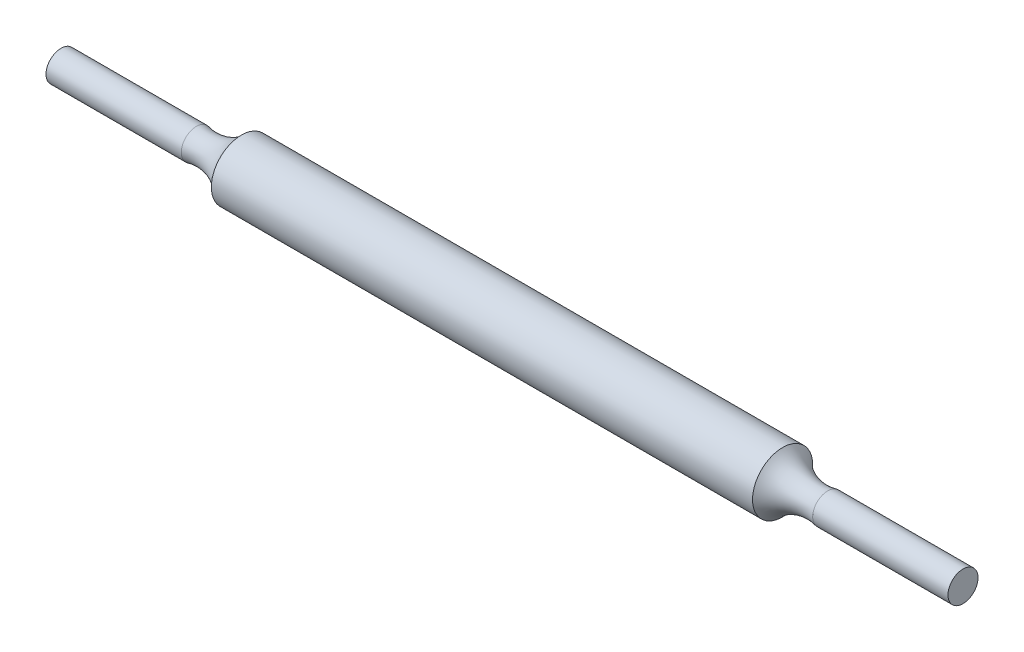
ISO-10303-21;
HEADER;
FILE_DESCRIPTION(('STEP AP214'),'2;1');
FILE_NAME('part.step','',(''),(''),'','','');
FILE_SCHEMA(('AUTOMOTIVE_DESIGN { 1 0 10303 214 1 1 1 1 }'));
ENDSEC;
DATA;
#1=APPLICATION_CONTEXT('core data for automotive mechanical design processes');
#2=APPLICATION_PROTOCOL_DEFINITION('international standard','automotive_design',2000,#1);
#3=PRODUCT_CONTEXT('',#1,'mechanical');
#4=PRODUCT('Part','Part','',(#3));
#5=PRODUCT_RELATED_PRODUCT_CATEGORY('part','',(#4));
#6=PRODUCT_DEFINITION_FORMATION('','',#4);
#7=PRODUCT_DEFINITION_CONTEXT('part definition',#1,'design');
#8=PRODUCT_DEFINITION('design','',#6,#7);
#9=PRODUCT_DEFINITION_SHAPE('','',#8);
#10=(LENGTH_UNIT() NAMED_UNIT(*) SI_UNIT(.MILLI.,.METRE.));
#11=(NAMED_UNIT(*) PLANE_ANGLE_UNIT() SI_UNIT($,.RADIAN.));
#12=(NAMED_UNIT(*) SI_UNIT($,.STERADIAN.) SOLID_ANGLE_UNIT());
#13=UNCERTAINTY_MEASURE_WITH_UNIT(LENGTH_MEASURE(1.E-05),#10,'distance_accuracy_value','');
#14=(GEOMETRIC_REPRESENTATION_CONTEXT(3) GLOBAL_UNCERTAINTY_ASSIGNED_CONTEXT((#13)) GLOBAL_UNIT_ASSIGNED_CONTEXT((#10,
#11,#12)) REPRESENTATION_CONTEXT('',''));
#15=CARTESIAN_POINT('',(0.,0.,0.));
#16=DIRECTION('',(0.,0.,1.));
#17=DIRECTION('',(1.,0.,0.));
#18=AXIS2_PLACEMENT_3D('',#15,#16,#17);
#19=CARTESIAN_POINT('',(-762.,0.,0.));
#20=DIRECTION('',(-1.,0.,0.));
#21=DIRECTION('',(0.,0.,1.));
#22=AXIS2_PLACEMENT_3D('',#19,#20,#21);
#23=CYLINDRICAL_SURFACE('',#22,25.4);
#24=CARTESIAN_POINT('',(-762.,0.,0.));
#25=DIRECTION('',(-1.,0.,0.));
#26=DIRECTION('',(0.,0.,1.));
#27=AXIS2_PLACEMENT_3D('',#24,#25,#26);
#28=CIRCLE('',#27,25.4);
#29=CARTESIAN_POINT('',(-762.,0.,25.4));
#30=VERTEX_POINT('',#29);
#31=EDGE_CURVE('E57',#30,#30,#28,.T.);
#32=ORIENTED_EDGE('',*,*,#31,.F.);
#33=EDGE_LOOP('',(#32));
#34=FACE_BOUND('',#33,.T.);
#35=CARTESIAN_POINT('',(-533.4,0.,0.));
#36=DIRECTION('',(-1.,0.,0.));
#37=DIRECTION('',(0.,0.,1.));
#38=AXIS2_PLACEMENT_3D('',#35,#36,#37);
#39=CIRCLE('',#38,25.4000000000001);
#40=CARTESIAN_POINT('',(-533.4,0.,25.4000000000001));
#41=VERTEX_POINT('',#40);
#42=EDGE_CURVE('E10',#41,#41,#39,.T.);
#43=ORIENTED_EDGE('',*,*,#42,.T.);
#44=EDGE_LOOP('',(#43));
#45=FACE_BOUND('',#44,.T.);
#46=ADVANCED_FACE('F35',(#34,#45),#23,.T.);
#47=CARTESIAN_POINT('',(-515.778134680678,0.,0.));
#48=DIRECTION('',(-1.,0.,0.));
#49=DIRECTION('',(0.,0.,1.));
#50=AXIS2_PLACEMENT_3D('',#47,#48,#49);
#51=TOROIDAL_SURFACE('',#50,99.5344040420351,76.2000000000001);
#52=ORIENTED_EDGE('',*,*,#42,.F.);
#53=EDGE_LOOP('',(#52));
#54=FACE_BOUND('',#53,.T.);
#55=CARTESIAN_POINT('',(-457.2,0.,0.));
#56=DIRECTION('',(-1.,0.,0.));
#57=DIRECTION('',(0.,0.,1.));
#58=AXIS2_PLACEMENT_3D('',#55,#56,#57);
#59=CIRCLE('',#58,50.8000000000001);
#60=CARTESIAN_POINT('',(-457.2,0.,50.8000000000001));
#61=VERTEX_POINT('',#60);
#62=EDGE_CURVE('E41',#61,#61,#59,.T.);
#63=ORIENTED_EDGE('',*,*,#62,.T.);
#64=EDGE_LOOP('',(#63));
#65=FACE_BOUND('',#64,.T.);
#66=ADVANCED_FACE('F64',(#54,#65),#51,.F.);
#67=CARTESIAN_POINT('',(-762.,0.,0.));
#68=DIRECTION('',(-1.,0.,0.));
#69=DIRECTION('',(0.,0.,1.));
#70=AXIS2_PLACEMENT_3D('',#67,#68,#69);
#71=CYLINDRICAL_SURFACE('',#70,50.8000000000001);
#72=ORIENTED_EDGE('',*,*,#62,.F.);
#73=EDGE_LOOP('',(#72));
#74=FACE_BOUND('',#73,.T.);
#75=CARTESIAN_POINT('',(457.2,0.,0.));
#76=DIRECTION('',(-1.,0.,0.));
#77=DIRECTION('',(0.,0.,1.));
#78=AXIS2_PLACEMENT_3D('',#75,#76,#77);
#79=CIRCLE('',#78,50.8000000000001);
#80=CARTESIAN_POINT('',(457.2,0.,50.8000000000001));
#81=VERTEX_POINT('',#80);
#82=EDGE_CURVE('E45',#81,#81,#79,.T.);
#83=ORIENTED_EDGE('',*,*,#82,.T.);
#84=EDGE_LOOP('',(#83));
#85=FACE_BOUND('',#84,.T.);
#86=ADVANCED_FACE('F68',(#74,#85),#71,.T.);
#87=CARTESIAN_POINT('',(515.778134680678,0.,0.));
#88=DIRECTION('',(-1.,0.,0.));
#89=DIRECTION('',(0.,0.,1.));
#90=AXIS2_PLACEMENT_3D('',#87,#88,#89);
#91=TOROIDAL_SURFACE('',#90,99.5344040420351,76.2000000000001);
#92=ORIENTED_EDGE('',*,*,#82,.F.);
#93=EDGE_LOOP('',(#92));
#94=FACE_BOUND('',#93,.T.);
#95=CARTESIAN_POINT('',(533.4,0.,0.));
#96=DIRECTION('',(-1.,0.,0.));
#97=DIRECTION('',(0.,0.,1.));
#98=AXIS2_PLACEMENT_3D('',#95,#96,#97);
#99=CIRCLE('',#98,25.4);
#100=CARTESIAN_POINT('',(533.4,0.,25.4));
#101=VERTEX_POINT('',#100);
#102=EDGE_CURVE('E49',#101,#101,#99,.T.);
#103=ORIENTED_EDGE('',*,*,#102,.T.);
#104=EDGE_LOOP('',(#103));
#105=FACE_BOUND('',#104,.T.);
#106=ADVANCED_FACE('F73',(#94,#105),#91,.F.);
#107=CARTESIAN_POINT('',(-762.,0.,0.));
#108=DIRECTION('',(-1.,0.,0.));
#109=DIRECTION('',(0.,0.,1.));
#110=AXIS2_PLACEMENT_3D('',#107,#108,#109);
#111=CYLINDRICAL_SURFACE('',#110,25.4);
#112=ORIENTED_EDGE('',*,*,#102,.F.);
#113=EDGE_LOOP('',(#112));
#114=FACE_BOUND('',#113,.T.);
#115=CARTESIAN_POINT('',(762.,0.,0.));
#116=DIRECTION('',(-1.,0.,0.));
#117=DIRECTION('',(0.,0.,1.));
#118=AXIS2_PLACEMENT_3D('',#115,#116,#117);
#119=CIRCLE('',#118,25.4);
#120=CARTESIAN_POINT('',(762.,0.,25.4));
#121=VERTEX_POINT('',#120);
#122=EDGE_CURVE('E54',#121,#121,#119,.T.);
#123=ORIENTED_EDGE('',*,*,#122,.T.);
#124=EDGE_LOOP('',(#123));
#125=FACE_BOUND('',#124,.T.);
#126=ADVANCED_FACE('F79',(#114,#125),#111,.T.);
#127=CARTESIAN_POINT('',(762.,0.,0.));
#128=DIRECTION('',(-1.,0.,0.));
#129=DIRECTION('',(0.,0.,1.));
#130=AXIS2_PLACEMENT_3D('',#127,#128,#129);
#131=PLANE('',#130);
#132=ORIENTED_EDGE('',*,*,#122,.F.);
#133=EDGE_LOOP('',(#132));
#134=FACE_BOUND('',#133,.T.);
#135=ADVANCED_FACE('F83',(#134),#131,.F.);
#136=CARTESIAN_POINT('',(-762.,0.,0.));
#137=DIRECTION('',(1.,0.,0.));
#138=DIRECTION('',(0.,0.,-1.));
#139=AXIS2_PLACEMENT_3D('',#136,#137,#138);
#140=PLANE('',#139);
#141=ORIENTED_EDGE('',*,*,#31,.T.);
#142=EDGE_LOOP('',(#141));
#143=FACE_BOUND('',#142,.T.);
#144=ADVANCED_FACE('F61',(#143),#140,.F.);
#145=CLOSED_SHELL('',(#46,#66,#86,#106,#126,#135,#144));
#146=MANIFOLD_SOLID_BREP('B2',#145);
#147=ADVANCED_BREP_SHAPE_REPRESENTATION('',(#18,#146),#14);
#148=SHAPE_DEFINITION_REPRESENTATION(#9,#147);
ENDSEC;
END-ISO-10303-21;
